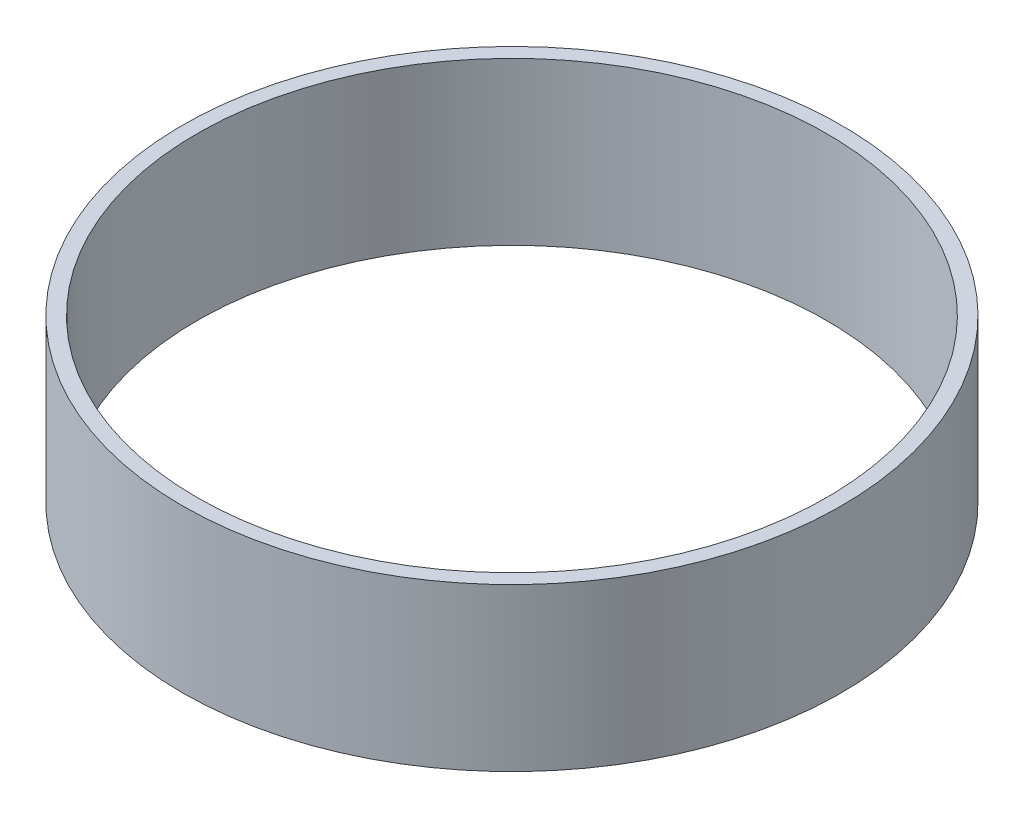
ISO-10303-21;
HEADER;
FILE_DESCRIPTION(('STEP AP214'),'2;1');
FILE_NAME('part.step','',(''),(''),'','','');
FILE_SCHEMA(('AUTOMOTIVE_DESIGN { 1 0 10303 214 1 1 1 1 }'));
ENDSEC;
DATA;
#1=APPLICATION_CONTEXT('core data for automotive mechanical design processes');
#2=APPLICATION_PROTOCOL_DEFINITION('international standard','automotive_design',2000,#1);
#3=PRODUCT_CONTEXT('',#1,'mechanical');
#4=PRODUCT('Part','Part','',(#3));
#5=PRODUCT_RELATED_PRODUCT_CATEGORY('part','',(#4));
#6=PRODUCT_DEFINITION_FORMATION('','',#4);
#7=PRODUCT_DEFINITION_CONTEXT('part definition',#1,'design');
#8=PRODUCT_DEFINITION('design','',#6,#7);
#9=PRODUCT_DEFINITION_SHAPE('','',#8);
#10=(LENGTH_UNIT() NAMED_UNIT(*) SI_UNIT(.MILLI.,.METRE.));
#11=(NAMED_UNIT(*) PLANE_ANGLE_UNIT() SI_UNIT($,.RADIAN.));
#12=(NAMED_UNIT(*) SI_UNIT($,.STERADIAN.) SOLID_ANGLE_UNIT());
#13=UNCERTAINTY_MEASURE_WITH_UNIT(LENGTH_MEASURE(1.E-05),#10,'distance_accuracy_value','');
#14=(GEOMETRIC_REPRESENTATION_CONTEXT(3) GLOBAL_UNCERTAINTY_ASSIGNED_CONTEXT((#13)) GLOBAL_UNIT_ASSIGNED_CONTEXT((#10,
#11,#12)) REPRESENTATION_CONTEXT('',''));
#15=CARTESIAN_POINT('',(0.,0.,0.));
#16=DIRECTION('',(0.,0.,1.));
#17=DIRECTION('',(1.,0.,0.));
#18=AXIS2_PLACEMENT_3D('',#15,#16,#17);
#19=CARTESIAN_POINT('',(0.,-5.13605265007536,0.));
#20=DIRECTION('',(0.,1.,0.));
#21=DIRECTION('',(0.,0.,1.));
#22=AXIS2_PLACEMENT_3D('',#19,#20,#21);
#23=CYLINDRICAL_SURFACE('',#22,25.8445);
#24=CARTESIAN_POINT('',(0.,-5.13605265007536,0.));
#25=DIRECTION('',(0.,1.,0.));
#26=DIRECTION('',(0.,0.,1.));
#27=AXIS2_PLACEMENT_3D('',#24,#25,#26);
#28=CIRCLE('',#27,25.8445);
#29=CARTESIAN_POINT('',(0.,-5.13605265007536,25.8445));
#30=VERTEX_POINT('',#29);
#31=EDGE_CURVE('E10',#30,#30,#28,.T.);
#32=ORIENTED_EDGE('',*,*,#31,.T.);
#33=EDGE_LOOP('',(#32));
#34=FACE_BOUND('',#33,.T.);
#35=CARTESIAN_POINT('',(0.,7.56394734992464,0.));
#36=DIRECTION('',(0.,1.,0.));
#37=DIRECTION('',(0.,0.,1.));
#38=AXIS2_PLACEMENT_3D('',#35,#36,#37);
#39=CIRCLE('',#38,25.8445);
#40=CARTESIAN_POINT('',(0.,7.56394734992464,25.8445));
#41=VERTEX_POINT('',#40);
#42=EDGE_CURVE('E22',#41,#41,#39,.T.);
#43=ORIENTED_EDGE('',*,*,#42,.F.);
#44=EDGE_LOOP('',(#43));
#45=FACE_BOUND('',#44,.T.);
#46=ADVANCED_FACE('F15',(#34,#45),#23,.T.);
#47=CARTESIAN_POINT('',(0.,-5.13605265007536,0.));
#48=DIRECTION('',(0.,1.,0.));
#49=DIRECTION('',(0.,0.,1.));
#50=AXIS2_PLACEMENT_3D('',#47,#48,#49);
#51=PLANE('',#50);
#52=CARTESIAN_POINT('',(0.,-5.13605265007536,0.));
#53=DIRECTION('',(0.,1.,0.));
#54=DIRECTION('',(0.,0.,1.));
#55=AXIS2_PLACEMENT_3D('',#52,#53,#54);
#56=CIRCLE('',#55,24.7015);
#57=CARTESIAN_POINT('',(0.,-5.13605265007536,24.7015));
#58=VERTEX_POINT('',#57);
#59=EDGE_CURVE('E29',#58,#58,#56,.T.);
#60=ORIENTED_EDGE('',*,*,#59,.T.);
#61=EDGE_LOOP('',(#60));
#62=FACE_BOUND('',#61,.T.);
#63=ORIENTED_EDGE('',*,*,#31,.F.);
#64=EDGE_LOOP('',(#63));
#65=FACE_BOUND('',#64,.T.);
#66=ADVANCED_FACE('F44',(#62,#65),#51,.F.);
#67=CARTESIAN_POINT('',(0.,7.56394734992464,0.));
#68=DIRECTION('',(0.,1.,0.));
#69=DIRECTION('',(0.,0.,1.));
#70=AXIS2_PLACEMENT_3D('',#67,#68,#69);
#71=PLANE('',#70);
#72=CARTESIAN_POINT('',(0.,7.56394734992464,0.));
#73=DIRECTION('',(0.,1.,0.));
#74=DIRECTION('',(0.,0.,1.));
#75=AXIS2_PLACEMENT_3D('',#72,#73,#74);
#76=CIRCLE('',#75,24.7015);
#77=CARTESIAN_POINT('',(0.,7.56394734992464,24.7015));
#78=VERTEX_POINT('',#77);
#79=EDGE_CURVE('E34',#78,#78,#76,.T.);
#80=ORIENTED_EDGE('',*,*,#79,.F.);
#81=EDGE_LOOP('',(#80));
#82=FACE_BOUND('',#81,.T.);
#83=ORIENTED_EDGE('',*,*,#42,.T.);
#84=EDGE_LOOP('',(#83));
#85=FACE_BOUND('',#84,.T.);
#86=ADVANCED_FACE('F42',(#82,#85),#71,.T.);
#87=CARTESIAN_POINT('',(0.,-5.13605265007536,0.));
#88=DIRECTION('',(0.,1.,0.));
#89=DIRECTION('',(0.,0.,1.));
#90=AXIS2_PLACEMENT_3D('',#87,#88,#89);
#91=CYLINDRICAL_SURFACE('',#90,24.7015);
#92=ORIENTED_EDGE('',*,*,#59,.F.);
#93=EDGE_LOOP('',(#92));
#94=FACE_BOUND('',#93,.T.);
#95=ORIENTED_EDGE('',*,*,#79,.T.);
#96=EDGE_LOOP('',(#95));
#97=FACE_BOUND('',#96,.T.);
#98=ADVANCED_FACE('F40',(#94,#97),#91,.F.);
#99=CLOSED_SHELL('',(#46,#66,#86,#98));
#100=MANIFOLD_SOLID_BREP('B1',#99);
#101=ADVANCED_BREP_SHAPE_REPRESENTATION('',(#18,#100),#14);
#102=SHAPE_DEFINITION_REPRESENTATION(#9,#101);
ENDSEC;
END-ISO-10303-21;
